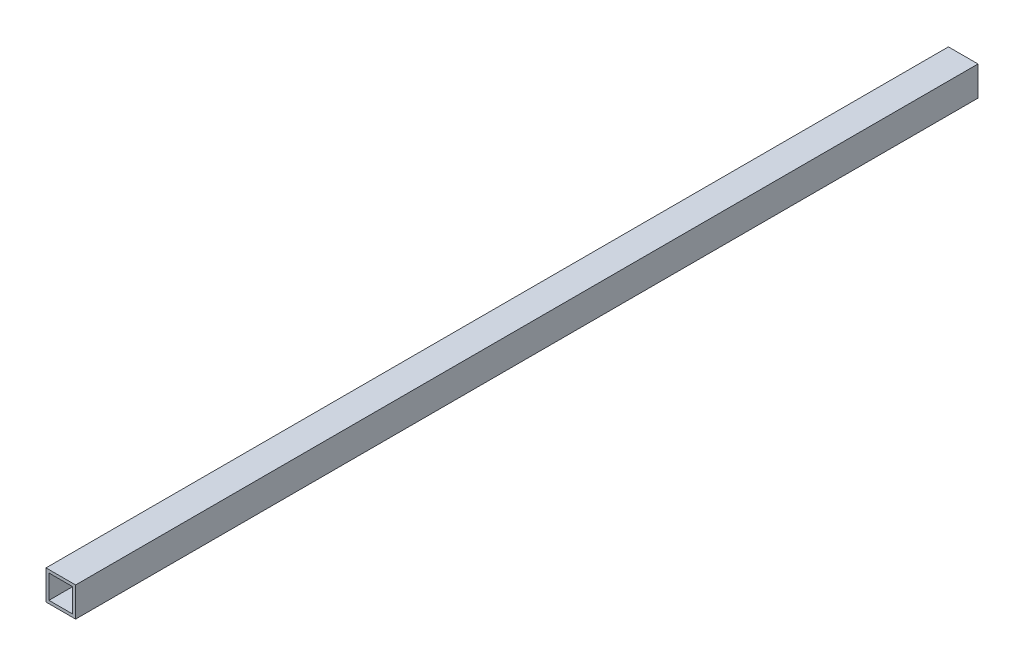
ISO-10303-21;
HEADER;
FILE_DESCRIPTION(('STEP AP214'),'2;1');
FILE_NAME('part.step','',(''),(''),'','','');
FILE_SCHEMA(('AUTOMOTIVE_DESIGN { 1 0 10303 214 1 1 1 1 }'));
ENDSEC;
DATA;
#1=APPLICATION_CONTEXT('core data for automotive mechanical design processes');
#2=APPLICATION_PROTOCOL_DEFINITION('international standard','automotive_design',2000,#1);
#3=PRODUCT_CONTEXT('',#1,'mechanical');
#4=PRODUCT('Part','Part','',(#3));
#5=PRODUCT_RELATED_PRODUCT_CATEGORY('part','',(#4));
#6=PRODUCT_DEFINITION_FORMATION('','',#4);
#7=PRODUCT_DEFINITION_CONTEXT('part definition',#1,'design');
#8=PRODUCT_DEFINITION('design','',#6,#7);
#9=PRODUCT_DEFINITION_SHAPE('','',#8);
#10=(LENGTH_UNIT() NAMED_UNIT(*) SI_UNIT(.MILLI.,.METRE.));
#11=(NAMED_UNIT(*) PLANE_ANGLE_UNIT() SI_UNIT($,.RADIAN.));
#12=(NAMED_UNIT(*) SI_UNIT($,.STERADIAN.) SOLID_ANGLE_UNIT());
#13=UNCERTAINTY_MEASURE_WITH_UNIT(LENGTH_MEASURE(1.E-05),#10,'distance_accuracy_value','');
#14=(GEOMETRIC_REPRESENTATION_CONTEXT(3) GLOBAL_UNCERTAINTY_ASSIGNED_CONTEXT((#13)) GLOBAL_UNIT_ASSIGNED_CONTEXT((#10,
#11,#12)) REPRESENTATION_CONTEXT('',''));
#15=CARTESIAN_POINT('',(0.,0.,0.));
#16=DIRECTION('',(0.,0.,1.));
#17=DIRECTION('',(1.,0.,0.));
#18=AXIS2_PLACEMENT_3D('',#15,#16,#17);
#19=CARTESIAN_POINT('',(0.,0.,304.8));
#20=DIRECTION('',(0.,0.,1.));
#21=DIRECTION('',(1.,0.,0.));
#22=AXIS2_PLACEMENT_3D('',#19,#20,#21);
#23=PLANE('',#22);
#24=DIRECTION('',(0.,1.,0.));
#25=VECTOR('',#24,1.);
#26=CARTESIAN_POINT('',(10.,-10.,304.8));
#27=LINE('',#26,#25);
#28=CARTESIAN_POINT('',(10.,-10.,304.8));
#29=VERTEX_POINT('',#28);
#30=CARTESIAN_POINT('',(10.,10.,304.8));
#31=VERTEX_POINT('',#30);
#32=EDGE_CURVE('E108',#29,#31,#27,.T.);
#33=ORIENTED_EDGE('',*,*,#32,.T.);
#34=DIRECTION('',(-1.,0.,0.));
#35=VECTOR('',#34,1.);
#36=CARTESIAN_POINT('',(10.,10.,304.8));
#37=LINE('',#36,#35);
#38=CARTESIAN_POINT('',(-10.,10.,304.8));
#39=VERTEX_POINT('',#38);
#40=EDGE_CURVE('E151',#31,#39,#37,.T.);
#41=ORIENTED_EDGE('',*,*,#40,.T.);
#42=DIRECTION('',(0.,-1.,0.));
#43=VECTOR('',#42,1.);
#44=CARTESIAN_POINT('',(-10.,-10.,304.8));
#45=LINE('',#44,#43);
#46=CARTESIAN_POINT('',(-10.,-10.,304.8));
#47=VERTEX_POINT('',#46);
#48=EDGE_CURVE('E153',#39,#47,#45,.T.);
#49=ORIENTED_EDGE('',*,*,#48,.T.);
#50=DIRECTION('',(1.,0.,0.));
#51=VECTOR('',#50,1.);
#52=CARTESIAN_POINT('',(10.,-10.,304.8));
#53=LINE('',#52,#51);
#54=EDGE_CURVE('E55',#47,#29,#53,.T.);
#55=ORIENTED_EDGE('',*,*,#54,.T.);
#56=EDGE_LOOP('',(#33,#41,#49,#55));
#57=FACE_BOUND('',#56,.T.);
#58=DIRECTION('',(-1.,0.,0.));
#59=VECTOR('',#58,1.);
#60=CARTESIAN_POINT('',(8.,8.,304.8));
#61=LINE('',#60,#59);
#62=CARTESIAN_POINT('',(8.,8.,304.8));
#63=VERTEX_POINT('',#62);
#64=CARTESIAN_POINT('',(-8.,8.,304.8));
#65=VERTEX_POINT('',#64);
#66=EDGE_CURVE('E140',#63,#65,#61,.T.);
#67=ORIENTED_EDGE('',*,*,#66,.F.);
#68=DIRECTION('',(0.,1.,0.));
#69=VECTOR('',#68,1.);
#70=CARTESIAN_POINT('',(8.,-8.,304.8));
#71=LINE('',#70,#69);
#72=CARTESIAN_POINT('',(8.,-8.,304.8));
#73=VERTEX_POINT('',#72);
#74=EDGE_CURVE('E105',#73,#63,#71,.T.);
#75=ORIENTED_EDGE('',*,*,#74,.F.);
#76=DIRECTION('',(1.,0.,0.));
#77=VECTOR('',#76,1.);
#78=CARTESIAN_POINT('',(8.,-8.,304.8));
#79=LINE('',#78,#77);
#80=CARTESIAN_POINT('',(-8.,-8.,304.8));
#81=VERTEX_POINT('',#80);
#82=EDGE_CURVE('E144',#81,#73,#79,.T.);
#83=ORIENTED_EDGE('',*,*,#82,.F.);
#84=DIRECTION('',(0.,-1.,0.));
#85=VECTOR('',#84,1.);
#86=CARTESIAN_POINT('',(-8.,-8.,304.8));
#87=LINE('',#86,#85);
#88=EDGE_CURVE('E142',#65,#81,#87,.T.);
#89=ORIENTED_EDGE('',*,*,#88,.F.);
#90=EDGE_LOOP('',(#67,#75,#83,#89));
#91=FACE_BOUND('',#90,.T.);
#92=ADVANCED_FACE('F32',(#57,#91),#23,.T.);
#93=CARTESIAN_POINT('',(10.,-10.,304.8));
#94=DIRECTION('',(-1.,0.,0.));
#95=DIRECTION('',(0.,0.,1.));
#96=AXIS2_PLACEMENT_3D('',#93,#94,#95);
#97=PLANE('',#96);
#98=DIRECTION('',(0.,0.,-1.));
#99=VECTOR('',#98,1.);
#100=CARTESIAN_POINT('',(10.,-10.,304.8));
#101=LINE('',#100,#99);
#102=CARTESIAN_POINT('',(10.,-10.,-304.8));
#103=VERTEX_POINT('',#102);
#104=EDGE_CURVE('E156',#29,#103,#101,.T.);
#105=ORIENTED_EDGE('',*,*,#104,.T.);
#106=DIRECTION('',(0.,1.,0.));
#107=VECTOR('',#106,1.);
#108=CARTESIAN_POINT('',(10.,-10.,-304.8));
#109=LINE('',#108,#107);
#110=CARTESIAN_POINT('',(10.,10.,-304.8));
#111=VERTEX_POINT('',#110);
#112=EDGE_CURVE('E127',#103,#111,#109,.T.);
#113=ORIENTED_EDGE('',*,*,#112,.T.);
#114=DIRECTION('',(0.,0.,-1.));
#115=VECTOR('',#114,1.);
#116=CARTESIAN_POINT('',(10.,10.,304.8));
#117=LINE('',#116,#115);
#118=EDGE_CURVE('E11',#31,#111,#117,.T.);
#119=ORIENTED_EDGE('',*,*,#118,.F.);
#120=ORIENTED_EDGE('',*,*,#32,.F.);
#121=EDGE_LOOP('',(#105,#113,#119,#120));
#122=FACE_BOUND('',#121,.T.);
#123=ADVANCED_FACE('F34',(#122),#97,.F.);
#124=CARTESIAN_POINT('',(10.,10.,304.8));
#125=DIRECTION('',(0.,-1.,0.));
#126=DIRECTION('',(1.,0.,0.));
#127=AXIS2_PLACEMENT_3D('',#124,#125,#126);
#128=PLANE('',#127);
#129=ORIENTED_EDGE('',*,*,#118,.T.);
#130=DIRECTION('',(-1.,0.,0.));
#131=VECTOR('',#130,1.);
#132=CARTESIAN_POINT('',(10.,10.,-304.8));
#133=LINE('',#132,#131);
#134=CARTESIAN_POINT('',(-10.,10.,-304.8));
#135=VERTEX_POINT('',#134);
#136=EDGE_CURVE('E130',#111,#135,#133,.T.);
#137=ORIENTED_EDGE('',*,*,#136,.T.);
#138=DIRECTION('',(0.,0.,-1.));
#139=VECTOR('',#138,1.);
#140=CARTESIAN_POINT('',(-10.,10.,304.8));
#141=LINE('',#140,#139);
#142=EDGE_CURVE('E40',#39,#135,#141,.T.);
#143=ORIENTED_EDGE('',*,*,#142,.F.);
#144=ORIENTED_EDGE('',*,*,#40,.F.);
#145=EDGE_LOOP('',(#129,#137,#143,#144));
#146=FACE_BOUND('',#145,.T.);
#147=ADVANCED_FACE('F169',(#146),#128,.F.);
#148=CARTESIAN_POINT('',(-10.,-10.,304.8));
#149=DIRECTION('',(1.,0.,0.));
#150=DIRECTION('',(0.,0.,-1.));
#151=AXIS2_PLACEMENT_3D('',#148,#149,#150);
#152=PLANE('',#151);
#153=ORIENTED_EDGE('',*,*,#142,.T.);
#154=DIRECTION('',(0.,-1.,0.));
#155=VECTOR('',#154,1.);
#156=CARTESIAN_POINT('',(-10.,-10.,-304.8));
#157=LINE('',#156,#155);
#158=CARTESIAN_POINT('',(-10.,-10.,-304.8));
#159=VERTEX_POINT('',#158);
#160=EDGE_CURVE('E133',#135,#159,#157,.T.);
#161=ORIENTED_EDGE('',*,*,#160,.T.);
#162=DIRECTION('',(0.,0.,-1.));
#163=VECTOR('',#162,1.);
#164=CARTESIAN_POINT('',(-10.,-10.,304.8));
#165=LINE('',#164,#163);
#166=EDGE_CURVE('E158',#47,#159,#165,.T.);
#167=ORIENTED_EDGE('',*,*,#166,.F.);
#168=ORIENTED_EDGE('',*,*,#48,.F.);
#169=EDGE_LOOP('',(#153,#161,#167,#168));
#170=FACE_BOUND('',#169,.T.);
#171=ADVANCED_FACE('F163',(#170),#152,.F.);
#172=CARTESIAN_POINT('',(10.,-10.,304.8));
#173=DIRECTION('',(0.,1.,0.));
#174=DIRECTION('',(-1.,0.,0.));
#175=AXIS2_PLACEMENT_3D('',#172,#173,#174);
#176=PLANE('',#175);
#177=ORIENTED_EDGE('',*,*,#166,.T.);
#178=DIRECTION('',(1.,0.,0.));
#179=VECTOR('',#178,1.);
#180=CARTESIAN_POINT('',(10.,-10.,-304.8));
#181=LINE('',#180,#179);
#182=EDGE_CURVE('E136',#159,#103,#181,.T.);
#183=ORIENTED_EDGE('',*,*,#182,.T.);
#184=ORIENTED_EDGE('',*,*,#104,.F.);
#185=ORIENTED_EDGE('',*,*,#54,.F.);
#186=EDGE_LOOP('',(#177,#183,#184,#185));
#187=FACE_BOUND('',#186,.T.);
#188=ADVANCED_FACE('F174',(#187),#176,.F.);
#189=CARTESIAN_POINT('',(8.,-8.,304.8));
#190=DIRECTION('',(-1.,0.,0.));
#191=DIRECTION('',(0.,0.,1.));
#192=AXIS2_PLACEMENT_3D('',#189,#190,#191);
#193=PLANE('',#192);
#194=DIRECTION('',(0.,0.,-1.));
#195=VECTOR('',#194,1.);
#196=CARTESIAN_POINT('',(8.,8.,304.8));
#197=LINE('',#196,#195);
#198=CARTESIAN_POINT('',(8.,8.,-304.8));
#199=VERTEX_POINT('',#198);
#200=EDGE_CURVE('E97',#63,#199,#197,.T.);
#201=ORIENTED_EDGE('',*,*,#200,.T.);
#202=DIRECTION('',(0.,1.,0.));
#203=VECTOR('',#202,1.);
#204=CARTESIAN_POINT('',(8.,-8.,-304.8));
#205=LINE('',#204,#203);
#206=CARTESIAN_POINT('',(8.,-8.,-304.8));
#207=VERTEX_POINT('',#206);
#208=EDGE_CURVE('E102',#207,#199,#205,.T.);
#209=ORIENTED_EDGE('',*,*,#208,.F.);
#210=DIRECTION('',(0.,0.,-1.));
#211=VECTOR('',#210,1.);
#212=CARTESIAN_POINT('',(8.,-8.,304.8));
#213=LINE('',#212,#211);
#214=EDGE_CURVE('E146',#73,#207,#213,.T.);
#215=ORIENTED_EDGE('',*,*,#214,.F.);
#216=ORIENTED_EDGE('',*,*,#74,.T.);
#217=EDGE_LOOP('',(#201,#209,#215,#216));
#218=FACE_BOUND('',#217,.T.);
#219=ADVANCED_FACE('F99',(#218),#193,.T.);
#220=CARTESIAN_POINT('',(8.,8.,304.8));
#221=DIRECTION('',(0.,-1.,0.));
#222=DIRECTION('',(0.,0.,-1.));
#223=AXIS2_PLACEMENT_3D('',#220,#221,#222);
#224=PLANE('',#223);
#225=DIRECTION('',(0.,0.,-1.));
#226=VECTOR('',#225,1.);
#227=CARTESIAN_POINT('',(-8.,8.,304.8));
#228=LINE('',#227,#226);
#229=CARTESIAN_POINT('',(-8.,8.,-304.8));
#230=VERTEX_POINT('',#229);
#231=EDGE_CURVE('E109',#65,#230,#228,.T.);
#232=ORIENTED_EDGE('',*,*,#231,.T.);
#233=DIRECTION('',(-1.,0.,0.));
#234=VECTOR('',#233,1.);
#235=CARTESIAN_POINT('',(8.,8.,-304.8));
#236=LINE('',#235,#234);
#237=EDGE_CURVE('E112',#199,#230,#236,.T.);
#238=ORIENTED_EDGE('',*,*,#237,.F.);
#239=ORIENTED_EDGE('',*,*,#200,.F.);
#240=ORIENTED_EDGE('',*,*,#66,.T.);
#241=EDGE_LOOP('',(#232,#238,#239,#240));
#242=FACE_BOUND('',#241,.T.);
#243=ADVANCED_FACE('F113',(#242),#224,.T.);
#244=CARTESIAN_POINT('',(-8.,-8.,304.8));
#245=DIRECTION('',(1.,0.,0.));
#246=DIRECTION('',(0.,0.,-1.));
#247=AXIS2_PLACEMENT_3D('',#244,#245,#246);
#248=PLANE('',#247);
#249=DIRECTION('',(0.,0.,-1.));
#250=VECTOR('',#249,1.);
#251=CARTESIAN_POINT('',(-8.,-8.,304.8));
#252=LINE('',#251,#250);
#253=CARTESIAN_POINT('',(-8.,-8.,-304.8));
#254=VERTEX_POINT('',#253);
#255=EDGE_CURVE('E47',#81,#254,#252,.T.);
#256=ORIENTED_EDGE('',*,*,#255,.T.);
#257=DIRECTION('',(0.,-1.,0.));
#258=VECTOR('',#257,1.);
#259=CARTESIAN_POINT('',(-8.,-8.,-304.8));
#260=LINE('',#259,#258);
#261=EDGE_CURVE('E118',#230,#254,#260,.T.);
#262=ORIENTED_EDGE('',*,*,#261,.F.);
#263=ORIENTED_EDGE('',*,*,#231,.F.);
#264=ORIENTED_EDGE('',*,*,#88,.T.);
#265=EDGE_LOOP('',(#256,#262,#263,#264));
#266=FACE_BOUND('',#265,.T.);
#267=ADVANCED_FACE('F192',(#266),#248,.T.);
#268=CARTESIAN_POINT('',(8.,-8.,304.8));
#269=DIRECTION('',(0.,1.,0.));
#270=DIRECTION('',(-1.,0.,0.));
#271=AXIS2_PLACEMENT_3D('',#268,#269,#270);
#272=PLANE('',#271);
#273=ORIENTED_EDGE('',*,*,#214,.T.);
#274=DIRECTION('',(1.,0.,0.));
#275=VECTOR('',#274,1.);
#276=CARTESIAN_POINT('',(8.,-8.,-304.8));
#277=LINE('',#276,#275);
#278=EDGE_CURVE('E122',#254,#207,#277,.T.);
#279=ORIENTED_EDGE('',*,*,#278,.F.);
#280=ORIENTED_EDGE('',*,*,#255,.F.);
#281=ORIENTED_EDGE('',*,*,#82,.T.);
#282=EDGE_LOOP('',(#273,#279,#280,#281));
#283=FACE_BOUND('',#282,.T.);
#284=ADVANCED_FACE('F195',(#283),#272,.T.);
#285=CARTESIAN_POINT('',(0.,0.,-304.8));
#286=DIRECTION('',(0.,0.,1.));
#287=DIRECTION('',(1.,0.,0.));
#288=AXIS2_PLACEMENT_3D('',#285,#286,#287);
#289=PLANE('',#288);
#290=ORIENTED_EDGE('',*,*,#278,.T.);
#291=ORIENTED_EDGE('',*,*,#208,.T.);
#292=ORIENTED_EDGE('',*,*,#237,.T.);
#293=ORIENTED_EDGE('',*,*,#261,.T.);
#294=EDGE_LOOP('',(#290,#291,#292,#293));
#295=FACE_BOUND('',#294,.T.);
#296=ORIENTED_EDGE('',*,*,#112,.F.);
#297=ORIENTED_EDGE('',*,*,#182,.F.);
#298=ORIENTED_EDGE('',*,*,#160,.F.);
#299=ORIENTED_EDGE('',*,*,#136,.F.);
#300=EDGE_LOOP('',(#296,#297,#298,#299));
#301=FACE_BOUND('',#300,.T.);
#302=ADVANCED_FACE('F120',(#295,#301),#289,.F.);
#303=CLOSED_SHELL('',(#92,#123,#147,#171,#188,#219,#243,#267,#284,#302));
#304=MANIFOLD_SOLID_BREP('B2',#303);
#305=ADVANCED_BREP_SHAPE_REPRESENTATION('',(#18,#304),#14);
#306=SHAPE_DEFINITION_REPRESENTATION(#9,#305);
ENDSEC;
END-ISO-10303-21;
